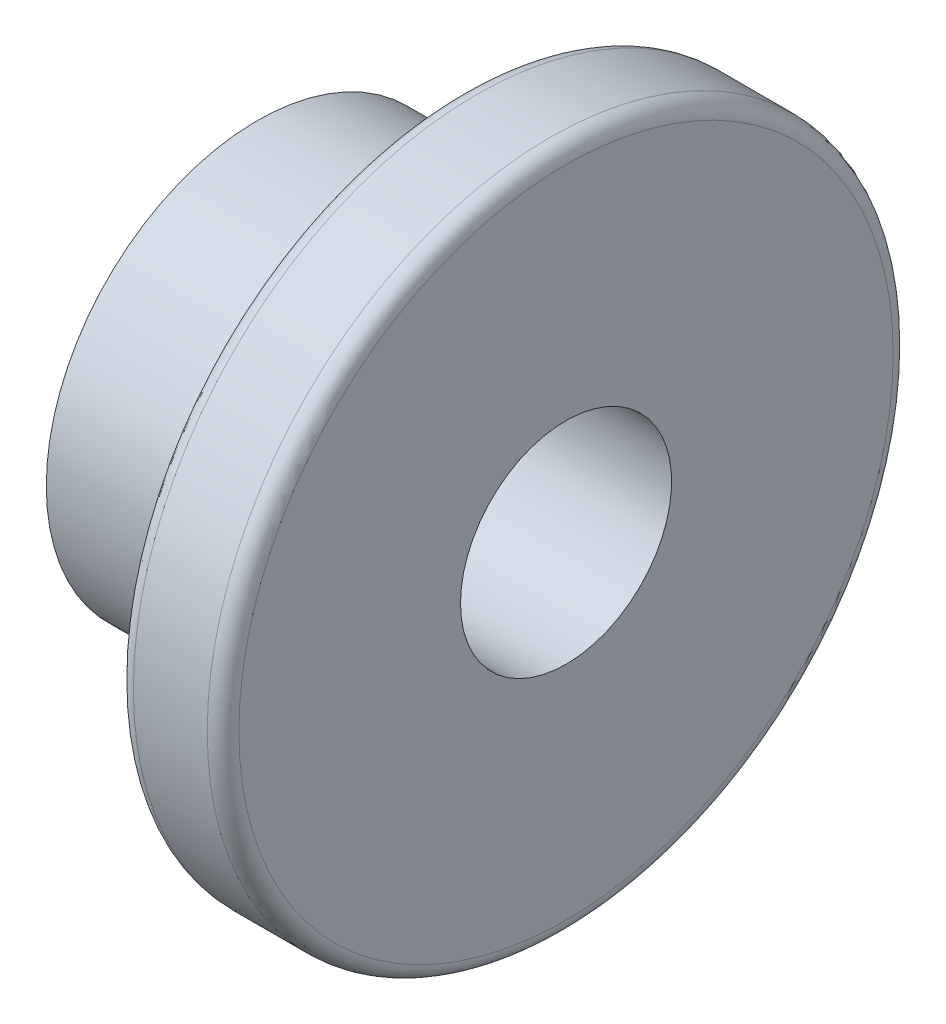
ISO-10303-21;
HEADER;
FILE_DESCRIPTION(('STEP AP214'),'2;1');
FILE_NAME('part.step','',(''),(''),'','','');
FILE_SCHEMA(('AUTOMOTIVE_DESIGN { 1 0 10303 214 1 1 1 1 }'));
ENDSEC;
DATA;
#1=APPLICATION_CONTEXT('core data for automotive mechanical design processes');
#2=APPLICATION_PROTOCOL_DEFINITION('international standard','automotive_design',2000,#1);
#3=PRODUCT_CONTEXT('',#1,'mechanical');
#4=PRODUCT('Part','Part','',(#3));
#5=PRODUCT_RELATED_PRODUCT_CATEGORY('part','',(#4));
#6=PRODUCT_DEFINITION_FORMATION('','',#4);
#7=PRODUCT_DEFINITION_CONTEXT('part definition',#1,'design');
#8=PRODUCT_DEFINITION('design','',#6,#7);
#9=PRODUCT_DEFINITION_SHAPE('','',#8);
#10=(LENGTH_UNIT() NAMED_UNIT(*) SI_UNIT(.MILLI.,.METRE.));
#11=(NAMED_UNIT(*) PLANE_ANGLE_UNIT() SI_UNIT($,.RADIAN.));
#12=(NAMED_UNIT(*) SI_UNIT($,.STERADIAN.) SOLID_ANGLE_UNIT());
#13=UNCERTAINTY_MEASURE_WITH_UNIT(LENGTH_MEASURE(1.E-05),#10,'distance_accuracy_value','');
#14=(GEOMETRIC_REPRESENTATION_CONTEXT(3) GLOBAL_UNCERTAINTY_ASSIGNED_CONTEXT((#13)) GLOBAL_UNIT_ASSIGNED_CONTEXT((#10,
#11,#12)) REPRESENTATION_CONTEXT('',''));
#15=CARTESIAN_POINT('',(0.,0.,0.));
#16=DIRECTION('',(0.,0.,1.));
#17=DIRECTION('',(1.,0.,0.));
#18=AXIS2_PLACEMENT_3D('',#15,#16,#17);
#19=CARTESIAN_POINT('',(0.,8.,0.));
#20=DIRECTION('',(1.,0.,0.));
#21=DIRECTION('',(0.,0.,-1.));
#22=AXIS2_PLACEMENT_3D('',#19,#20,#21);
#23=PLANE('',#22);
#24=CARTESIAN_POINT('',(0.,0.,0.));
#25=DIRECTION('',(-1.,0.,0.));
#26=DIRECTION('',(0.,0.,1.));
#27=AXIS2_PLACEMENT_3D('',#24,#25,#26);
#28=CIRCLE('',#27,4.);
#29=CARTESIAN_POINT('',(0.,0.,4.));
#30=VERTEX_POINT('',#29);
#31=EDGE_CURVE('E51',#30,#30,#28,.T.);
#32=ORIENTED_EDGE('',*,*,#31,.F.);
#33=EDGE_LOOP('',(#32));
#34=FACE_BOUND('',#33,.T.);
#35=CARTESIAN_POINT('',(0.,0.,0.));
#36=DIRECTION('',(-1.,0.,0.));
#37=DIRECTION('',(0.,0.,1.));
#38=AXIS2_PLACEMENT_3D('',#35,#36,#37);
#39=CIRCLE('',#38,8.);
#40=CARTESIAN_POINT('',(0.,0.,8.));
#41=VERTEX_POINT('',#40);
#42=EDGE_CURVE('E60',#41,#41,#39,.T.);
#43=ORIENTED_EDGE('',*,*,#42,.T.);
#44=EDGE_LOOP('',(#43));
#45=FACE_BOUND('',#44,.T.);
#46=ADVANCED_FACE('F31',(#34,#45),#23,.F.);
#47=CARTESIAN_POINT('',(0.,0.,0.));
#48=DIRECTION('',(-1.,0.,0.));
#49=DIRECTION('',(0.,0.,1.));
#50=AXIS2_PLACEMENT_3D('',#47,#48,#49);
#51=CYLINDRICAL_SURFACE('',#50,4.);
#52=CARTESIAN_POINT('',(11.7,0.,0.));
#53=DIRECTION('',(-1.,0.,0.));
#54=DIRECTION('',(0.,0.,1.));
#55=AXIS2_PLACEMENT_3D('',#52,#53,#54);
#56=CIRCLE('',#55,4.);
#57=CARTESIAN_POINT('',(11.7,0.,4.));
#58=VERTEX_POINT('',#57);
#59=EDGE_CURVE('E54',#58,#58,#56,.T.);
#60=ORIENTED_EDGE('',*,*,#59,.F.);
#61=EDGE_LOOP('',(#60));
#62=FACE_BOUND('',#61,.T.);
#63=ORIENTED_EDGE('',*,*,#31,.T.);
#64=EDGE_LOOP('',(#63));
#65=FACE_BOUND('',#64,.T.);
#66=ADVANCED_FACE('F83',(#62,#65),#51,.F.);
#67=CARTESIAN_POINT('',(11.7,4.,0.));
#68=DIRECTION('',(-1.,0.,0.));
#69=DIRECTION('',(0.,0.,1.));
#70=AXIS2_PLACEMENT_3D('',#67,#68,#69);
#71=PLANE('',#70);
#72=CARTESIAN_POINT('',(11.7,0.,0.));
#73=DIRECTION('',(-1.,0.,0.));
#74=DIRECTION('',(0.,0.,1.));
#75=AXIS2_PLACEMENT_3D('',#72,#73,#74);
#76=CIRCLE('',#75,12.4);
#77=CARTESIAN_POINT('',(11.7,0.,12.4));
#78=VERTEX_POINT('',#77);
#79=EDGE_CURVE('E38',#78,#78,#76,.F.);
#80=ORIENTED_EDGE('',*,*,#79,.T.);
#81=EDGE_LOOP('',(#80));
#82=FACE_BOUND('',#81,.T.);
#83=ORIENTED_EDGE('',*,*,#59,.T.);
#84=EDGE_LOOP('',(#83));
#85=FACE_BOUND('',#84,.T.);
#86=ADVANCED_FACE('F79',(#82,#85),#71,.F.);
#87=CARTESIAN_POINT('',(0.,0.,0.));
#88=DIRECTION('',(-1.,0.,0.));
#89=DIRECTION('',(0.,0.,1.));
#90=AXIS2_PLACEMENT_3D('',#87,#88,#89);
#91=CYLINDRICAL_SURFACE('',#90,13.);
#92=CARTESIAN_POINT('',(11.1,0.,0.));
#93=DIRECTION('',(-1.,0.,0.));
#94=DIRECTION('',(0.,0.,1.));
#95=AXIS2_PLACEMENT_3D('',#92,#93,#94);
#96=CIRCLE('',#95,13.);
#97=CARTESIAN_POINT('',(11.1,0.,13.));
#98=VERTEX_POINT('',#97);
#99=EDGE_CURVE('E42',#98,#98,#96,.T.);
#100=ORIENTED_EDGE('',*,*,#99,.T.);
#101=EDGE_LOOP('',(#100));
#102=FACE_BOUND('',#101,.T.);
#103=CARTESIAN_POINT('',(8.3,0.,0.));
#104=DIRECTION('',(1.,0.,0.));
#105=DIRECTION('',(0.,0.,-1.));
#106=AXIS2_PLACEMENT_3D('',#103,#104,#105);
#107=CIRCLE('',#106,13.);
#108=CARTESIAN_POINT('',(8.3,0.,-13.));
#109=VERTEX_POINT('',#108);
#110=EDGE_CURVE('E46',#109,#109,#107,.T.);
#111=ORIENTED_EDGE('',*,*,#110,.T.);
#112=EDGE_LOOP('',(#111));
#113=FACE_BOUND('',#112,.T.);
#114=ADVANCED_FACE('F74',(#102,#113),#91,.T.);
#115=CARTESIAN_POINT('',(7.7,13.,0.));
#116=DIRECTION('',(1.,0.,0.));
#117=DIRECTION('',(0.,0.,-1.));
#118=AXIS2_PLACEMENT_3D('',#115,#116,#117);
#119=PLANE('',#118);
#120=CARTESIAN_POINT('',(7.7,0.,0.));
#121=DIRECTION('',(1.,0.,0.));
#122=DIRECTION('',(0.,0.,-1.));
#123=AXIS2_PLACEMENT_3D('',#120,#121,#122);
#124=CIRCLE('',#123,12.4);
#125=CARTESIAN_POINT('',(7.7,0.,-12.4));
#126=VERTEX_POINT('',#125);
#127=EDGE_CURVE('E10',#126,#126,#124,.F.);
#128=ORIENTED_EDGE('',*,*,#127,.T.);
#129=EDGE_LOOP('',(#128));
#130=FACE_BOUND('',#129,.T.);
#131=CARTESIAN_POINT('',(7.7,0.,0.));
#132=DIRECTION('',(-1.,0.,0.));
#133=DIRECTION('',(0.,0.,1.));
#134=AXIS2_PLACEMENT_3D('',#131,#132,#133);
#135=CIRCLE('',#134,8.);
#136=CARTESIAN_POINT('',(7.7,0.,8.));
#137=VERTEX_POINT('',#136);
#138=EDGE_CURVE('E57',#137,#137,#135,.T.);
#139=ORIENTED_EDGE('',*,*,#138,.F.);
#140=EDGE_LOOP('',(#139));
#141=FACE_BOUND('',#140,.T.);
#142=ADVANCED_FACE('F69',(#130,#141),#119,.F.);
#143=CARTESIAN_POINT('',(0.,0.,0.));
#144=DIRECTION('',(-1.,0.,0.));
#145=DIRECTION('',(0.,0.,1.));
#146=AXIS2_PLACEMENT_3D('',#143,#144,#145);
#147=CYLINDRICAL_SURFACE('',#146,8.);
#148=ORIENTED_EDGE('',*,*,#42,.F.);
#149=EDGE_LOOP('',(#148));
#150=FACE_BOUND('',#149,.T.);
#151=ORIENTED_EDGE('',*,*,#138,.T.);
#152=EDGE_LOOP('',(#151));
#153=FACE_BOUND('',#152,.T.);
#154=ADVANCED_FACE('F65',(#150,#153),#147,.T.);
#155=CARTESIAN_POINT('',(11.1,0.,0.));
#156=DIRECTION('',(-1.,0.,0.));
#157=DIRECTION('',(0.,0.,1.));
#158=AXIS2_PLACEMENT_3D('',#155,#156,#157);
#159=TOROIDAL_SURFACE('',#158,12.4,0.6);
#160=ORIENTED_EDGE('',*,*,#79,.F.);
#161=EDGE_LOOP('',(#160));
#162=FACE_BOUND('',#161,.T.);
#163=ORIENTED_EDGE('',*,*,#99,.F.);
#164=EDGE_LOOP('',(#163));
#165=FACE_BOUND('',#164,.T.);
#166=ADVANCED_FACE('F68',(#162,#165),#159,.T.);
#167=CARTESIAN_POINT('',(8.3,0.,0.));
#168=DIRECTION('',(1.,0.,0.));
#169=DIRECTION('',(0.,0.,-1.));
#170=AXIS2_PLACEMENT_3D('',#167,#168,#169);
#171=TOROIDAL_SURFACE('',#170,12.4,0.6);
#172=ORIENTED_EDGE('',*,*,#110,.F.);
#173=EDGE_LOOP('',(#172));
#174=FACE_BOUND('',#173,.T.);
#175=ORIENTED_EDGE('',*,*,#127,.F.);
#176=EDGE_LOOP('',(#175));
#177=FACE_BOUND('',#176,.T.);
#178=ADVANCED_FACE('F33',(#174,#177),#171,.T.);
#179=CLOSED_SHELL('',(#46,#66,#86,#114,#142,#154,#166,#178));
#180=MANIFOLD_SOLID_BREP('B2',#179);
#181=ADVANCED_BREP_SHAPE_REPRESENTATION('',(#18,#180),#14);
#182=SHAPE_DEFINITION_REPRESENTATION(#9,#181);
ENDSEC;
END-ISO-10303-21;
